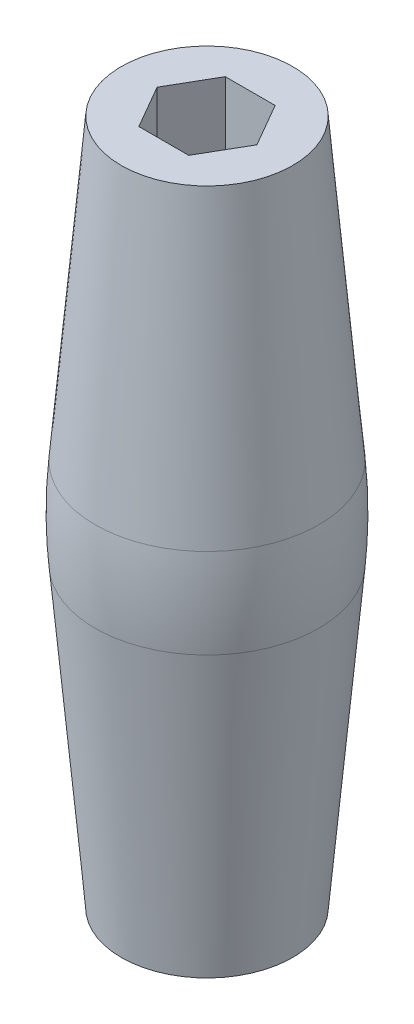
ISO-10303-21;
HEADER;
FILE_DESCRIPTION(('STEP AP214'),'2;1');
FILE_NAME('part.step','',(''),(''),'','','');
FILE_SCHEMA(('AUTOMOTIVE_DESIGN { 1 0 10303 214 1 1 1 1 }'));
ENDSEC;
DATA;
#1=APPLICATION_CONTEXT('core data for automotive mechanical design processes');
#2=APPLICATION_PROTOCOL_DEFINITION('international standard','automotive_design',2000,#1);
#3=PRODUCT_CONTEXT('',#1,'mechanical');
#4=PRODUCT('Part','Part','',(#3));
#5=PRODUCT_RELATED_PRODUCT_CATEGORY('part','',(#4));
#6=PRODUCT_DEFINITION_FORMATION('','',#4);
#7=PRODUCT_DEFINITION_CONTEXT('part definition',#1,'design');
#8=PRODUCT_DEFINITION('design','',#6,#7);
#9=PRODUCT_DEFINITION_SHAPE('','',#8);
#10=(LENGTH_UNIT() NAMED_UNIT(*) SI_UNIT(.MILLI.,.METRE.));
#11=(NAMED_UNIT(*) PLANE_ANGLE_UNIT() SI_UNIT($,.RADIAN.));
#12=(NAMED_UNIT(*) SI_UNIT($,.STERADIAN.) SOLID_ANGLE_UNIT());
#13=UNCERTAINTY_MEASURE_WITH_UNIT(LENGTH_MEASURE(1.E-05),#10,'distance_accuracy_value','');
#14=(GEOMETRIC_REPRESENTATION_CONTEXT(3) GLOBAL_UNCERTAINTY_ASSIGNED_CONTEXT((#13)) GLOBAL_UNIT_ASSIGNED_CONTEXT((#10,
#11,#12)) REPRESENTATION_CONTEXT('',''));
#15=CARTESIAN_POINT('',(0.,0.,0.));
#16=DIRECTION('',(0.,0.,1.));
#17=DIRECTION('',(1.,0.,0.));
#18=AXIS2_PLACEMENT_3D('',#15,#16,#17);
#19=CARTESIAN_POINT('',(0.,101.6,0.));
#20=DIRECTION('',(0.,-1.,0.));
#21=DIRECTION('',(0.,0.,1.));
#22=AXIS2_PLACEMENT_3D('',#19,#20,#21);
#23=CONICAL_SURFACE('',#22,12.7,0.0872664625997167);
#24=CARTESIAN_POINT('',(0.,57.4412675973715,0.));
#25=DIRECTION('',(0.,1.,0.));
#26=DIRECTION('',(0.,0.,1.));
#27=AXIS2_PLACEMENT_3D('',#24,#25,#26);
#28=CIRCLE('',#27,16.5633884809049);
#29=CARTESIAN_POINT('',(0.,57.4412675973715,16.5633884809049));
#30=VERTEX_POINT('',#29);
#31=EDGE_CURVE('E11',#30,#30,#28,.T.);
#32=ORIENTED_EDGE('',*,*,#31,.T.);
#33=EDGE_LOOP('',(#32));
#34=FACE_BOUND('',#33,.T.);
#35=CARTESIAN_POINT('',(0.,101.6,0.));
#36=DIRECTION('',(0.,1.,0.));
#37=DIRECTION('',(0.,0.,1.));
#38=AXIS2_PLACEMENT_3D('',#35,#36,#37);
#39=CIRCLE('',#38,12.7);
#40=CARTESIAN_POINT('',(0.,101.6,12.7));
#41=VERTEX_POINT('',#40);
#42=EDGE_CURVE('E131',#41,#41,#39,.T.);
#43=ORIENTED_EDGE('',*,*,#42,.F.);
#44=EDGE_LOOP('',(#43));
#45=FACE_BOUND('',#44,.T.);
#46=ADVANCED_FACE('F33',(#34,#45),#23,.T.);
#47=CARTESIAN_POINT('',(0.,101.6,0.));
#48=DIRECTION('',(0.,1.,0.));
#49=DIRECTION('',(0.,0.,1.));
#50=AXIS2_PLACEMENT_3D('',#47,#48,#49);
#51=PLANE('',#50);
#52=DIRECTION('',(0.5,0.,0.866025403784438));
#53=VECTOR('',#52,1.);
#54=CARTESIAN_POINT('',(3.69550360302896,101.6,-6.4008));
#55=LINE('',#54,#53);
#56=CARTESIAN_POINT('',(3.69550360302896,101.6,-6.4008));
#57=VERTEX_POINT('',#56);
#58=CARTESIAN_POINT('',(7.39100720605791,101.6,0.));
#59=VERTEX_POINT('',#58);
#60=EDGE_CURVE('E88',#57,#59,#55,.T.);
#61=ORIENTED_EDGE('',*,*,#60,.T.);
#62=DIRECTION('',(-0.5,0.,0.866025403784439));
#63=VECTOR('',#62,1.);
#64=CARTESIAN_POINT('',(7.39100720605791,101.6,0.));
#65=LINE('',#64,#63);
#66=CARTESIAN_POINT('',(3.69550360302896,101.6,6.4008));
#67=VERTEX_POINT('',#66);
#68=EDGE_CURVE('E97',#59,#67,#65,.T.);
#69=ORIENTED_EDGE('',*,*,#68,.T.);
#70=DIRECTION('',(-1.,0.,0.));
#71=VECTOR('',#70,1.);
#72=CARTESIAN_POINT('',(3.69550360302896,101.6,6.4008));
#73=LINE('',#72,#71);
#74=CARTESIAN_POINT('',(-3.69550360302896,101.6,6.4008));
#75=VERTEX_POINT('',#74);
#76=EDGE_CURVE('E48',#67,#75,#73,.T.);
#77=ORIENTED_EDGE('',*,*,#76,.T.);
#78=DIRECTION('',(-0.5,0.,-0.866025403784439));
#79=VECTOR('',#78,1.);
#80=CARTESIAN_POINT('',(-3.69550360302896,101.6,6.4008));
#81=LINE('',#80,#79);
#82=CARTESIAN_POINT('',(-7.39100720605791,101.6,0.));
#83=VERTEX_POINT('',#82);
#84=EDGE_CURVE('E112',#75,#83,#81,.T.);
#85=ORIENTED_EDGE('',*,*,#84,.T.);
#86=DIRECTION('',(0.5,0.,-0.866025403784439));
#87=VECTOR('',#86,1.);
#88=CARTESIAN_POINT('',(-7.39100720605791,101.6,0.));
#89=LINE('',#88,#87);
#90=CARTESIAN_POINT('',(-3.69550360302896,101.6,-6.4008));
#91=VERTEX_POINT('',#90);
#92=EDGE_CURVE('E115',#83,#91,#89,.T.);
#93=ORIENTED_EDGE('',*,*,#92,.T.);
#94=DIRECTION('',(1.,0.,0.));
#95=VECTOR('',#94,1.);
#96=CARTESIAN_POINT('',(-3.69550360302896,101.6,-6.4008));
#97=LINE('',#96,#95);
#98=EDGE_CURVE('E94',#91,#57,#97,.T.);
#99=ORIENTED_EDGE('',*,*,#98,.T.);
#100=EDGE_LOOP('',(#61,#69,#77,#85,#93,#99));
#101=FACE_BOUND('',#100,.T.);
#102=ORIENTED_EDGE('',*,*,#42,.T.);
#103=EDGE_LOOP('',(#102));
#104=FACE_BOUND('',#103,.T.);
#105=ADVANCED_FACE('F101',(#101,#104),#51,.T.);
#106=CARTESIAN_POINT('',(0.,0.,0.));
#107=DIRECTION('',(0.,1.,0.));
#108=DIRECTION('',(0.,0.,-1.));
#109=AXIS2_PLACEMENT_3D('',#106,#107,#108);
#110=CONICAL_SURFACE('',#109,12.7,0.0872664625997169);
#111=CARTESIAN_POINT('',(0.,44.1587324026284,0.));
#112=DIRECTION('',(0.,-1.,0.));
#113=DIRECTION('',(0.,0.,-1.));
#114=AXIS2_PLACEMENT_3D('',#111,#112,#113);
#115=CIRCLE('',#114,16.5633884809049);
#116=CARTESIAN_POINT('',(0.,44.1587324026284,-16.5633884809049));
#117=VERTEX_POINT('',#116);
#118=EDGE_CURVE('E41',#117,#117,#115,.T.);
#119=ORIENTED_EDGE('',*,*,#118,.T.);
#120=EDGE_LOOP('',(#119));
#121=FACE_BOUND('',#120,.T.);
#122=CARTESIAN_POINT('',(0.,0.,0.));
#123=DIRECTION('',(0.,1.,0.));
#124=DIRECTION('',(0.,0.,1.));
#125=AXIS2_PLACEMENT_3D('',#122,#123,#124);
#126=CIRCLE('',#125,12.7);
#127=CARTESIAN_POINT('',(0.,0.,12.7));
#128=VERTEX_POINT('',#127);
#129=EDGE_CURVE('E141',#128,#128,#126,.T.);
#130=ORIENTED_EDGE('',*,*,#129,.T.);
#131=EDGE_LOOP('',(#130));
#132=FACE_BOUND('',#131,.T.);
#133=ADVANCED_FACE('F146',(#121,#132),#110,.T.);
#134=CARTESIAN_POINT('',(0.,0.,0.));
#135=DIRECTION('',(0.,1.,0.));
#136=DIRECTION('',(0.,0.,1.));
#137=AXIS2_PLACEMENT_3D('',#134,#135,#136);
#138=PLANE('',#137);
#139=DIRECTION('',(-0.5,0.,0.866025403784439));
#140=VECTOR('',#139,1.);
#141=CARTESIAN_POINT('',(7.39100720605791,0.,0.));
#142=LINE('',#141,#140);
#143=CARTESIAN_POINT('',(7.39100720605791,0.,0.));
#144=VERTEX_POINT('',#143);
#145=CARTESIAN_POINT('',(3.69550360302896,0.,6.4008));
#146=VERTEX_POINT('',#145);
#147=EDGE_CURVE('E119',#144,#146,#142,.T.);
#148=ORIENTED_EDGE('',*,*,#147,.F.);
#149=DIRECTION('',(0.5,0.,0.866025403784438));
#150=VECTOR('',#149,1.);
#151=CARTESIAN_POINT('',(3.69550360302896,0.,-6.4008));
#152=LINE('',#151,#150);
#153=CARTESIAN_POINT('',(3.69550360302896,0.,-6.4008));
#154=VERTEX_POINT('',#153);
#155=EDGE_CURVE('E56',#154,#144,#152,.T.);
#156=ORIENTED_EDGE('',*,*,#155,.F.);
#157=DIRECTION('',(1.,0.,0.));
#158=VECTOR('',#157,1.);
#159=CARTESIAN_POINT('',(-3.69550360302896,0.,-6.4008));
#160=LINE('',#159,#158);
#161=CARTESIAN_POINT('',(-3.69550360302896,0.,-6.4008));
#162=VERTEX_POINT('',#161);
#163=EDGE_CURVE('E105',#162,#154,#160,.T.);
#164=ORIENTED_EDGE('',*,*,#163,.F.);
#165=DIRECTION('',(0.5,0.,-0.866025403784439));
#166=VECTOR('',#165,1.);
#167=CARTESIAN_POINT('',(-7.39100720605791,0.,0.));
#168=LINE('',#167,#166);
#169=CARTESIAN_POINT('',(-7.39100720605791,0.,0.));
#170=VERTEX_POINT('',#169);
#171=EDGE_CURVE('E108',#170,#162,#168,.T.);
#172=ORIENTED_EDGE('',*,*,#171,.F.);
#173=DIRECTION('',(-0.5,0.,-0.866025403784439));
#174=VECTOR('',#173,1.);
#175=CARTESIAN_POINT('',(-3.69550360302896,0.,6.4008));
#176=LINE('',#175,#174);
#177=CARTESIAN_POINT('',(-3.69550360302896,0.,6.4008));
#178=VERTEX_POINT('',#177);
#179=EDGE_CURVE('E124',#178,#170,#176,.T.);
#180=ORIENTED_EDGE('',*,*,#179,.F.);
#181=DIRECTION('',(-1.,0.,0.));
#182=VECTOR('',#181,1.);
#183=CARTESIAN_POINT('',(3.69550360302896,0.,6.4008));
#184=LINE('',#183,#182);
#185=EDGE_CURVE('E121',#146,#178,#184,.T.);
#186=ORIENTED_EDGE('',*,*,#185,.F.);
#187=EDGE_LOOP('',(#148,#156,#164,#172,#180,#186));
#188=FACE_BOUND('',#187,.T.);
#189=ORIENTED_EDGE('',*,*,#129,.F.);
#190=EDGE_LOOP('',(#189));
#191=FACE_BOUND('',#190,.T.);
#192=ADVANCED_FACE('F167',(#188,#191),#138,.F.);
#193=CARTESIAN_POINT('',(3.69550360302896,101.6,-6.4008));
#194=DIRECTION('',(0.866025403784438,0.,-0.5));
#195=DIRECTION('',(-0.5,0.,-0.866025403784439));
#196=AXIS2_PLACEMENT_3D('',#193,#194,#195);
#197=PLANE('',#196);
#198=ORIENTED_EDGE('',*,*,#155,.T.);
#199=DIRECTION('',(0.,-1.,0.));
#200=VECTOR('',#199,1.);
#201=CARTESIAN_POINT('',(7.39100720605791,101.6,0.));
#202=LINE('',#201,#200);
#203=EDGE_CURVE('E84',#59,#144,#202,.T.);
#204=ORIENTED_EDGE('',*,*,#203,.F.);
#205=ORIENTED_EDGE('',*,*,#60,.F.);
#206=DIRECTION('',(0.,-1.,0.));
#207=VECTOR('',#206,1.);
#208=CARTESIAN_POINT('',(3.69550360302896,101.6,-6.4008));
#209=LINE('',#208,#207);
#210=EDGE_CURVE('E129',#57,#154,#209,.T.);
#211=ORIENTED_EDGE('',*,*,#210,.T.);
#212=EDGE_LOOP('',(#198,#204,#205,#211));
#213=FACE_BOUND('',#212,.T.);
#214=ADVANCED_FACE('F86',(#213),#197,.F.);
#215=CARTESIAN_POINT('',(-3.69550360302896,101.6,-6.4008));
#216=DIRECTION('',(0.,0.,-1.));
#217=DIRECTION('',(-1.,0.,0.));
#218=AXIS2_PLACEMENT_3D('',#215,#216,#217);
#219=PLANE('',#218);
#220=ORIENTED_EDGE('',*,*,#163,.T.);
#221=ORIENTED_EDGE('',*,*,#210,.F.);
#222=ORIENTED_EDGE('',*,*,#98,.F.);
#223=DIRECTION('',(0.,-1.,0.));
#224=VECTOR('',#223,1.);
#225=CARTESIAN_POINT('',(-3.69550360302896,101.6,-6.4008));
#226=LINE('',#225,#224);
#227=EDGE_CURVE('E132',#91,#162,#226,.T.);
#228=ORIENTED_EDGE('',*,*,#227,.T.);
#229=EDGE_LOOP('',(#220,#221,#222,#228));
#230=FACE_BOUND('',#229,.T.);
#231=ADVANCED_FACE('F174',(#230),#219,.F.);
#232=CARTESIAN_POINT('',(-7.39100720605791,101.6,0.));
#233=DIRECTION('',(-0.866025403784439,0.,-0.5));
#234=DIRECTION('',(-0.5,0.,0.866025403784439));
#235=AXIS2_PLACEMENT_3D('',#232,#233,#234);
#236=PLANE('',#235);
#237=ORIENTED_EDGE('',*,*,#171,.T.);
#238=ORIENTED_EDGE('',*,*,#227,.F.);
#239=ORIENTED_EDGE('',*,*,#92,.F.);
#240=DIRECTION('',(0.,-1.,0.));
#241=VECTOR('',#240,1.);
#242=CARTESIAN_POINT('',(-7.39100720605791,101.6,0.));
#243=LINE('',#242,#241);
#244=EDGE_CURVE('E134',#83,#170,#243,.T.);
#245=ORIENTED_EDGE('',*,*,#244,.T.);
#246=EDGE_LOOP('',(#237,#238,#239,#245));
#247=FACE_BOUND('',#246,.T.);
#248=ADVANCED_FACE('F186',(#247),#236,.F.);
#249=CARTESIAN_POINT('',(-3.69550360302896,101.6,6.4008));
#250=DIRECTION('',(-0.866025403784439,0.,0.5));
#251=DIRECTION('',(0.5,0.,0.866025403784439));
#252=AXIS2_PLACEMENT_3D('',#249,#250,#251);
#253=PLANE('',#252);
#254=ORIENTED_EDGE('',*,*,#179,.T.);
#255=ORIENTED_EDGE('',*,*,#244,.F.);
#256=ORIENTED_EDGE('',*,*,#84,.F.);
#257=DIRECTION('',(0.,-1.,0.));
#258=VECTOR('',#257,1.);
#259=CARTESIAN_POINT('',(-3.69550360302896,101.6,6.4008));
#260=LINE('',#259,#258);
#261=EDGE_CURVE('E136',#75,#178,#260,.T.);
#262=ORIENTED_EDGE('',*,*,#261,.T.);
#263=EDGE_LOOP('',(#254,#255,#256,#262));
#264=FACE_BOUND('',#263,.T.);
#265=ADVANCED_FACE('F183',(#264),#253,.F.);
#266=CARTESIAN_POINT('',(3.69550360302896,101.6,6.4008));
#267=DIRECTION('',(0.,0.,1.));
#268=DIRECTION('',(1.,0.,0.));
#269=AXIS2_PLACEMENT_3D('',#266,#267,#268);
#270=PLANE('',#269);
#271=ORIENTED_EDGE('',*,*,#185,.T.);
#272=ORIENTED_EDGE('',*,*,#261,.F.);
#273=ORIENTED_EDGE('',*,*,#76,.F.);
#274=DIRECTION('',(0.,-1.,0.));
#275=VECTOR('',#274,1.);
#276=CARTESIAN_POINT('',(3.69550360302896,101.6,6.4008));
#277=LINE('',#276,#275);
#278=EDGE_CURVE('E93',#67,#146,#277,.T.);
#279=ORIENTED_EDGE('',*,*,#278,.T.);
#280=EDGE_LOOP('',(#271,#272,#273,#279));
#281=FACE_BOUND('',#280,.T.);
#282=ADVANCED_FACE('F154',(#281),#270,.F.);
#283=CARTESIAN_POINT('',(7.39100720605791,101.6,0.));
#284=DIRECTION('',(0.866025403784439,0.,0.5));
#285=DIRECTION('',(0.5,0.,-0.866025403784439));
#286=AXIS2_PLACEMENT_3D('',#283,#284,#285);
#287=PLANE('',#286);
#288=ORIENTED_EDGE('',*,*,#147,.T.);
#289=ORIENTED_EDGE('',*,*,#278,.F.);
#290=ORIENTED_EDGE('',*,*,#68,.F.);
#291=ORIENTED_EDGE('',*,*,#203,.T.);
#292=EDGE_LOOP('',(#288,#289,#290,#291));
#293=FACE_BOUND('',#292,.T.);
#294=ADVANCED_FACE('F98',(#293),#287,.F.);
#295=CARTESIAN_POINT('',(0.,50.8,0.));
#296=DIRECTION('',(0.,1.,0.));
#297=DIRECTION('',(0.,0.,1.));
#298=AXIS2_PLACEMENT_3D('',#295,#296,#297);
#299=DEGENERATE_TOROIDAL_SURFACE('',#298,59.3466475136861,76.2,.F.);
#300=ORIENTED_EDGE('',*,*,#31,.F.);
#301=EDGE_LOOP('',(#300));
#302=FACE_BOUND('',#301,.T.);
#303=ORIENTED_EDGE('',*,*,#118,.F.);
#304=EDGE_LOOP('',(#303));
#305=FACE_BOUND('',#304,.T.);
#306=ADVANCED_FACE('F35',(#302,#305),#299,.F.);
#307=CLOSED_SHELL('',(#46,#105,#133,#192,#214,#231,#248,#265,#282,#294,#306));
#308=MANIFOLD_SOLID_BREP('B2',#307);
#309=ADVANCED_BREP_SHAPE_REPRESENTATION('',(#18,#308),#14);
#310=SHAPE_DEFINITION_REPRESENTATION(#9,#309);
ENDSEC;
END-ISO-10303-21;
